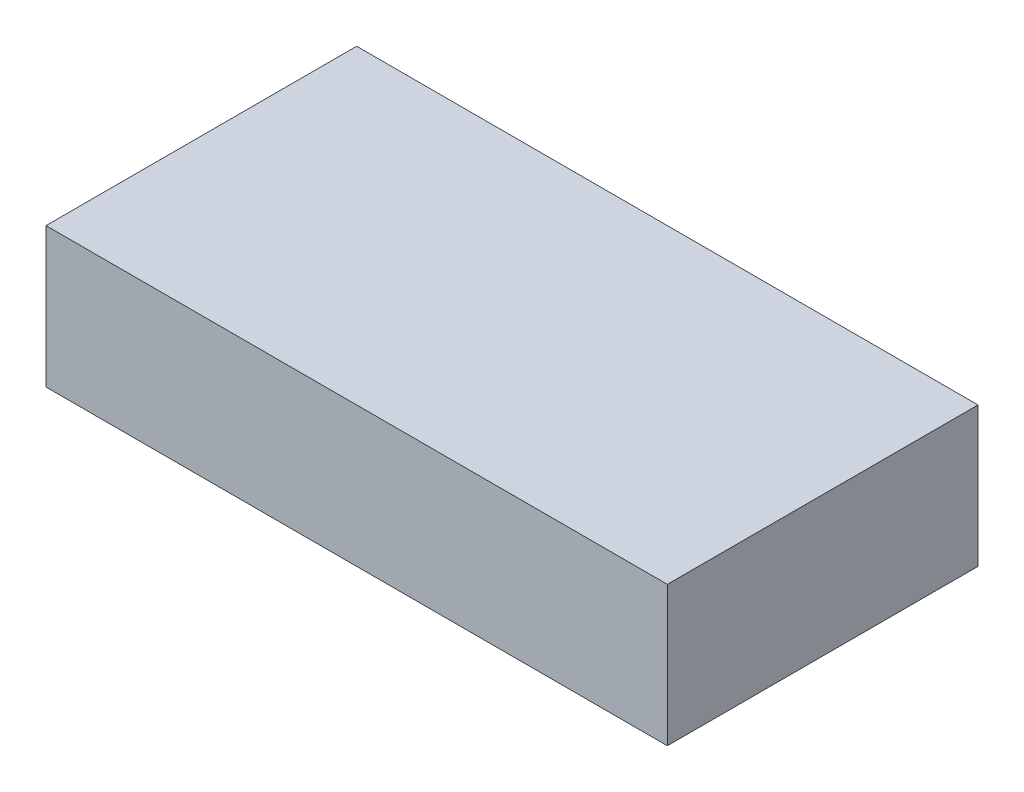
ISO-10303-21;
HEADER;
FILE_DESCRIPTION(('STEP AP214'),'2;1');
FILE_NAME('part.step','',(''),(''),'','','');
FILE_SCHEMA(('AUTOMOTIVE_DESIGN { 1 0 10303 214 1 1 1 1 }'));
ENDSEC;
DATA;
#1=APPLICATION_CONTEXT('core data for automotive mechanical design processes');
#2=APPLICATION_PROTOCOL_DEFINITION('international standard','automotive_design',2000,#1);
#3=PRODUCT_CONTEXT('',#1,'mechanical');
#4=PRODUCT('Part','Part','',(#3));
#5=PRODUCT_RELATED_PRODUCT_CATEGORY('part','',(#4));
#6=PRODUCT_DEFINITION_FORMATION('','',#4);
#7=PRODUCT_DEFINITION_CONTEXT('part definition',#1,'design');
#8=PRODUCT_DEFINITION('design','',#6,#7);
#9=PRODUCT_DEFINITION_SHAPE('','',#8);
#10=(LENGTH_UNIT() NAMED_UNIT(*) SI_UNIT(.MILLI.,.METRE.));
#11=(NAMED_UNIT(*) PLANE_ANGLE_UNIT() SI_UNIT($,.RADIAN.));
#12=(NAMED_UNIT(*) SI_UNIT($,.STERADIAN.) SOLID_ANGLE_UNIT());
#13=UNCERTAINTY_MEASURE_WITH_UNIT(LENGTH_MEASURE(1.E-05),#10,'distance_accuracy_value','');
#14=(GEOMETRIC_REPRESENTATION_CONTEXT(3) GLOBAL_UNCERTAINTY_ASSIGNED_CONTEXT((#13)) GLOBAL_UNIT_ASSIGNED_CONTEXT((#10,
#11,#12)) REPRESENTATION_CONTEXT('',''));
#15=CARTESIAN_POINT('',(0.,0.,0.));
#16=DIRECTION('',(0.,0.,1.));
#17=DIRECTION('',(1.,0.,0.));
#18=AXIS2_PLACEMENT_3D('',#15,#16,#17);
#19=CARTESIAN_POINT('',(-100.,45.,50.));
#20=DIRECTION('',(1.,0.,0.));
#21=DIRECTION('',(0.,0.,-1.));
#22=AXIS2_PLACEMENT_3D('',#19,#20,#21);
#23=PLANE('',#22);
#24=DIRECTION('',(0.,0.,1.));
#25=VECTOR('',#24,1.);
#26=CARTESIAN_POINT('',(-100.,0.,50.));
#27=LINE('',#26,#25);
#28=CARTESIAN_POINT('',(-100.,0.,-50.));
#29=VERTEX_POINT('',#28);
#30=CARTESIAN_POINT('',(-100.,0.,50.));
#31=VERTEX_POINT('',#30);
#32=EDGE_CURVE('E96',#29,#31,#27,.T.);
#33=ORIENTED_EDGE('',*,*,#32,.T.);
#34=DIRECTION('',(0.,-1.,0.));
#35=VECTOR('',#34,1.);
#36=CARTESIAN_POINT('',(-100.,45.,50.));
#37=LINE('',#36,#35);
#38=CARTESIAN_POINT('',(-100.,45.,50.));
#39=VERTEX_POINT('',#38);
#40=EDGE_CURVE('E11',#39,#31,#37,.T.);
#41=ORIENTED_EDGE('',*,*,#40,.F.);
#42=DIRECTION('',(0.,0.,1.));
#43=VECTOR('',#42,1.);
#44=CARTESIAN_POINT('',(-100.,45.,50.));
#45=LINE('',#44,#43);
#46=CARTESIAN_POINT('',(-100.,45.,-50.));
#47=VERTEX_POINT('',#46);
#48=EDGE_CURVE('E84',#47,#39,#45,.T.);
#49=ORIENTED_EDGE('',*,*,#48,.F.);
#50=DIRECTION('',(0.,-1.,0.));
#51=VECTOR('',#50,1.);
#52=CARTESIAN_POINT('',(-100.,45.,-50.));
#53=LINE('',#52,#51);
#54=EDGE_CURVE('E92',#47,#29,#53,.T.);
#55=ORIENTED_EDGE('',*,*,#54,.T.);
#56=EDGE_LOOP('',(#33,#41,#49,#55));
#57=FACE_BOUND('',#56,.T.);
#58=ADVANCED_FACE('F33',(#57),#23,.F.);
#59=CARTESIAN_POINT('',(100.,45.,50.));
#60=DIRECTION('',(0.,0.,-1.));
#61=DIRECTION('',(-1.,0.,0.));
#62=AXIS2_PLACEMENT_3D('',#59,#60,#61);
#63=PLANE('',#62);
#64=DIRECTION('',(1.,0.,0.));
#65=VECTOR('',#64,1.);
#66=CARTESIAN_POINT('',(100.,0.,50.));
#67=LINE('',#66,#65);
#68=CARTESIAN_POINT('',(100.,0.,50.));
#69=VERTEX_POINT('',#68);
#70=EDGE_CURVE('E88',#31,#69,#67,.T.);
#71=ORIENTED_EDGE('',*,*,#70,.T.);
#72=DIRECTION('',(0.,-1.,0.));
#73=VECTOR('',#72,1.);
#74=CARTESIAN_POINT('',(100.,45.,50.));
#75=LINE('',#74,#73);
#76=CARTESIAN_POINT('',(100.,45.,50.));
#77=VERTEX_POINT('',#76);
#78=EDGE_CURVE('E41',#77,#69,#75,.T.);
#79=ORIENTED_EDGE('',*,*,#78,.F.);
#80=DIRECTION('',(1.,0.,0.));
#81=VECTOR('',#80,1.);
#82=CARTESIAN_POINT('',(100.,45.,50.));
#83=LINE('',#82,#81);
#84=EDGE_CURVE('E79',#39,#77,#83,.T.);
#85=ORIENTED_EDGE('',*,*,#84,.F.);
#86=ORIENTED_EDGE('',*,*,#40,.T.);
#87=EDGE_LOOP('',(#71,#79,#85,#86));
#88=FACE_BOUND('',#87,.T.);
#89=ADVANCED_FACE('F87',(#88),#63,.F.);
#90=CARTESIAN_POINT('',(100.,45.,50.));
#91=DIRECTION('',(-1.,0.,0.));
#92=DIRECTION('',(0.,0.,1.));
#93=AXIS2_PLACEMENT_3D('',#90,#91,#92);
#94=PLANE('',#93);
#95=DIRECTION('',(0.,0.,-1.));
#96=VECTOR('',#95,1.);
#97=CARTESIAN_POINT('',(100.,0.,50.));
#98=LINE('',#97,#96);
#99=CARTESIAN_POINT('',(100.,0.,-50.));
#100=VERTEX_POINT('',#99);
#101=EDGE_CURVE('E66',#69,#100,#98,.T.);
#102=ORIENTED_EDGE('',*,*,#101,.T.);
#103=DIRECTION('',(0.,-1.,0.));
#104=VECTOR('',#103,1.);
#105=CARTESIAN_POINT('',(100.,45.,-50.));
#106=LINE('',#105,#104);
#107=CARTESIAN_POINT('',(100.,45.,-50.));
#108=VERTEX_POINT('',#107);
#109=EDGE_CURVE('E89',#108,#100,#106,.T.);
#110=ORIENTED_EDGE('',*,*,#109,.F.);
#111=DIRECTION('',(0.,0.,-1.));
#112=VECTOR('',#111,1.);
#113=CARTESIAN_POINT('',(100.,45.,50.));
#114=LINE('',#113,#112);
#115=EDGE_CURVE('E82',#77,#108,#114,.T.);
#116=ORIENTED_EDGE('',*,*,#115,.F.);
#117=ORIENTED_EDGE('',*,*,#78,.T.);
#118=EDGE_LOOP('',(#102,#110,#116,#117));
#119=FACE_BOUND('',#118,.T.);
#120=ADVANCED_FACE('F90',(#119),#94,.F.);
#121=CARTESIAN_POINT('',(100.,45.,-50.));
#122=DIRECTION('',(0.,0.,1.));
#123=DIRECTION('',(1.,0.,0.));
#124=AXIS2_PLACEMENT_3D('',#121,#122,#123);
#125=PLANE('',#124);
#126=DIRECTION('',(-1.,0.,0.));
#127=VECTOR('',#126,1.);
#128=CARTESIAN_POINT('',(100.,0.,-50.));
#129=LINE('',#128,#127);
#130=EDGE_CURVE('E72',#100,#29,#129,.T.);
#131=ORIENTED_EDGE('',*,*,#130,.T.);
#132=ORIENTED_EDGE('',*,*,#54,.F.);
#133=DIRECTION('',(-1.,0.,0.));
#134=VECTOR('',#133,1.);
#135=CARTESIAN_POINT('',(100.,45.,-50.));
#136=LINE('',#135,#134);
#137=EDGE_CURVE('E49',#108,#47,#136,.T.);
#138=ORIENTED_EDGE('',*,*,#137,.F.);
#139=ORIENTED_EDGE('',*,*,#109,.T.);
#140=EDGE_LOOP('',(#131,#132,#138,#139));
#141=FACE_BOUND('',#140,.T.);
#142=ADVANCED_FACE('F103',(#141),#125,.F.);
#143=CARTESIAN_POINT('',(0.,45.,0.));
#144=DIRECTION('',(0.,1.,0.));
#145=DIRECTION('',(0.,0.,1.));
#146=AXIS2_PLACEMENT_3D('',#143,#144,#145);
#147=PLANE('',#146);
#148=ORIENTED_EDGE('',*,*,#48,.T.);
#149=ORIENTED_EDGE('',*,*,#84,.T.);
#150=ORIENTED_EDGE('',*,*,#115,.T.);
#151=ORIENTED_EDGE('',*,*,#137,.T.);
#152=EDGE_LOOP('',(#148,#149,#150,#151));
#153=FACE_BOUND('',#152,.T.);
#154=ADVANCED_FACE('F80',(#153),#147,.T.);
#155=CARTESIAN_POINT('',(0.,0.,0.));
#156=DIRECTION('',(0.,1.,0.));
#157=DIRECTION('',(0.,0.,1.));
#158=AXIS2_PLACEMENT_3D('',#155,#156,#157);
#159=PLANE('',#158);
#160=ORIENTED_EDGE('',*,*,#32,.F.);
#161=ORIENTED_EDGE('',*,*,#130,.F.);
#162=ORIENTED_EDGE('',*,*,#101,.F.);
#163=ORIENTED_EDGE('',*,*,#70,.F.);
#164=EDGE_LOOP('',(#160,#161,#162,#163));
#165=FACE_BOUND('',#164,.T.);
#166=ADVANCED_FACE('F106',(#165),#159,.F.);
#167=CLOSED_SHELL('',(#58,#89,#120,#142,#154,#166));
#168=MANIFOLD_SOLID_BREP('B2',#167);
#169=ADVANCED_BREP_SHAPE_REPRESENTATION('',(#18,#168),#14);
#170=SHAPE_DEFINITION_REPRESENTATION(#9,#169);
ENDSEC;
END-ISO-10303-21;
